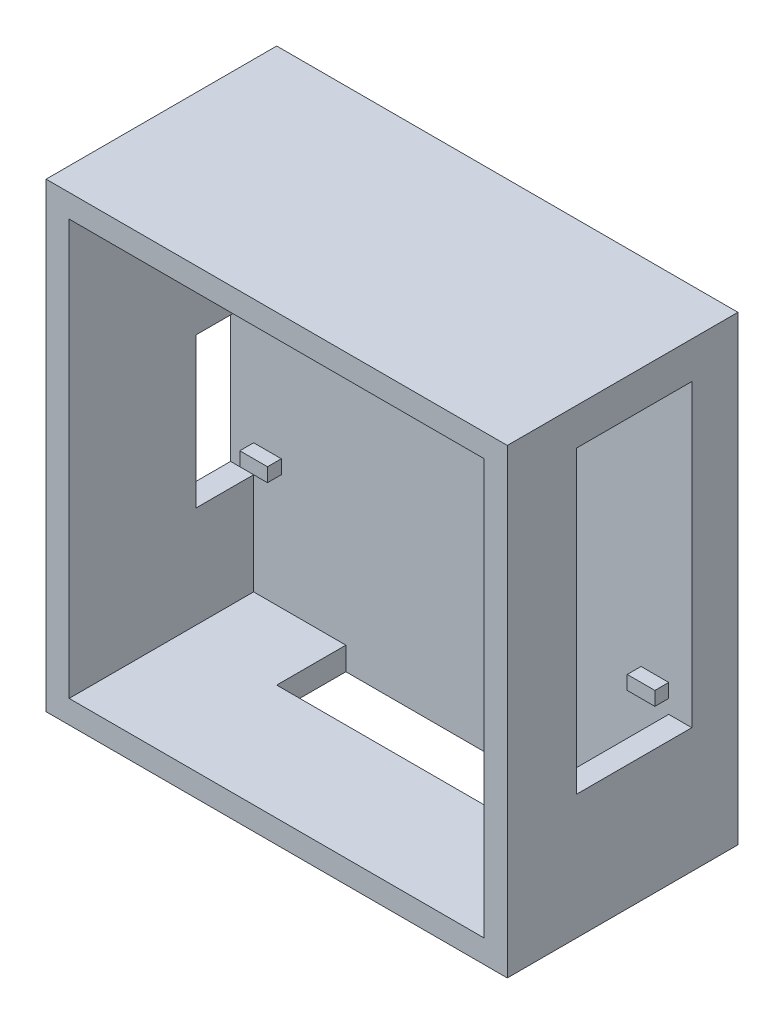
ISO-10303-21;
HEADER;
FILE_DESCRIPTION(('STEP AP214'),'2;1');
FILE_NAME('part.step','',(''),(''),'','','');
FILE_SCHEMA(('AUTOMOTIVE_DESIGN { 1 0 10303 214 1 1 1 1 }'));
ENDSEC;
DATA;
#1=APPLICATION_CONTEXT('core data for automotive mechanical design processes');
#2=APPLICATION_PROTOCOL_DEFINITION('international standard','automotive_design',2000,#1);
#3=PRODUCT_CONTEXT('',#1,'mechanical');
#4=PRODUCT('Part','Part','',(#3));
#5=PRODUCT_RELATED_PRODUCT_CATEGORY('part','',(#4));
#6=PRODUCT_DEFINITION_FORMATION('','',#4);
#7=PRODUCT_DEFINITION_CONTEXT('part definition',#1,'design');
#8=PRODUCT_DEFINITION('design','',#6,#7);
#9=PRODUCT_DEFINITION_SHAPE('','',#8);
#10=(LENGTH_UNIT() NAMED_UNIT(*) SI_UNIT(.MILLI.,.METRE.));
#11=(NAMED_UNIT(*) PLANE_ANGLE_UNIT() SI_UNIT($,.RADIAN.));
#12=(NAMED_UNIT(*) SI_UNIT($,.STERADIAN.) SOLID_ANGLE_UNIT());
#13=UNCERTAINTY_MEASURE_WITH_UNIT(LENGTH_MEASURE(1.E-05),#10,'distance_accuracy_value','');
#14=(GEOMETRIC_REPRESENTATION_CONTEXT(3) GLOBAL_UNCERTAINTY_ASSIGNED_CONTEXT((#13)) GLOBAL_UNIT_ASSIGNED_CONTEXT((#10,
#11,#12)) REPRESENTATION_CONTEXT('',''));
#15=CARTESIAN_POINT('',(0.,0.,0.));
#16=DIRECTION('',(0.,0.,1.));
#17=DIRECTION('',(1.,0.,0.));
#18=AXIS2_PLACEMENT_3D('',#15,#16,#17);
#19=CARTESIAN_POINT('',(0.,0.,10.));
#20=DIRECTION('',(0.,0.,-1.));
#21=DIRECTION('',(-1.,0.,0.));
#22=AXIS2_PLACEMENT_3D('',#19,#20,#21);
#23=PLANE('',#22);
#24=DIRECTION('',(0.,1.,0.));
#25=VECTOR('',#24,1.);
#26=CARTESIAN_POINT('',(11.,30.,10.));
#27=LINE('',#26,#25);
#28=CARTESIAN_POINT('',(11.,30.,10.));
#29=VERTEX_POINT('',#28);
#30=CARTESIAN_POINT('',(11.,33.,10.));
#31=VERTEX_POINT('',#30);
#32=EDGE_CURVE('E248',#29,#31,#27,.T.);
#33=ORIENTED_EDGE('',*,*,#32,.F.);
#34=DIRECTION('',(1.,0.,0.));
#35=VECTOR('',#34,1.);
#36=CARTESIAN_POINT('',(5.,30.,10.));
#37=LINE('',#36,#35);
#38=CARTESIAN_POINT('',(5.,30.,10.));
#39=VERTEX_POINT('',#38);
#40=EDGE_CURVE('E264',#39,#29,#37,.T.);
#41=ORIENTED_EDGE('',*,*,#40,.F.);
#42=DIRECTION('',(0.,-1.,0.));
#43=VECTOR('',#42,1.);
#44=CARTESIAN_POINT('',(5.,30.,10.));
#45=LINE('',#44,#43);
#46=CARTESIAN_POINT('',(5.00000000000001,33.,10.));
#47=VERTEX_POINT('',#46);
#48=EDGE_CURVE('E277',#47,#39,#45,.T.);
#49=ORIENTED_EDGE('',*,*,#48,.F.);
#50=DIRECTION('',(-1.,0.,0.));
#51=VECTOR('',#50,1.);
#52=CARTESIAN_POINT('',(5.00000000000001,33.,10.));
#53=LINE('',#52,#51);
#54=EDGE_CURVE('E253',#31,#47,#53,.T.);
#55=ORIENTED_EDGE('',*,*,#54,.F.);
#56=EDGE_LOOP('',(#33,#41,#49,#55));
#57=FACE_BOUND('',#56,.T.);
#58=DIRECTION('',(1.,0.,0.));
#59=VECTOR('',#58,1.);
#60=CARTESIAN_POINT('',(90.,92.,10.));
#61=LINE('',#60,#59);
#62=CARTESIAN_POINT('',(95.,92.,9.99999999999999));
#63=VERTEX_POINT('',#62);
#64=CARTESIAN_POINT('',(100.,92.,10.));
#65=VERTEX_POINT('',#64);
#66=EDGE_CURVE('E414',#63,#65,#61,.T.);
#67=ORIENTED_EDGE('',*,*,#66,.F.);
#68=DIRECTION('',(0.,1.,0.));
#69=VECTOR('',#68,1.);
#70=CARTESIAN_POINT('',(95.,95.,9.99999999999999));
#71=LINE('',#70,#69);
#72=CARTESIAN_POINT('',(95.,95.,9.99999999999999));
#73=VERTEX_POINT('',#72);
#74=EDGE_CURVE('E324',#63,#73,#71,.T.);
#75=ORIENTED_EDGE('',*,*,#74,.T.);
#76=DIRECTION('',(-1.,0.,0.));
#77=VECTOR('',#76,1.);
#78=CARTESIAN_POINT('',(5.,95.,9.99999999999999));
#79=LINE('',#78,#77);
#80=CARTESIAN_POINT('',(5.,95.,9.99999999999999));
#81=VERTEX_POINT('',#80);
#82=EDGE_CURVE('E303',#73,#81,#79,.T.);
#83=ORIENTED_EDGE('',*,*,#82,.T.);
#84=DIRECTION('',(0.,-1.,0.));
#85=VECTOR('',#84,1.);
#86=CARTESIAN_POINT('',(5.,95.,9.99999999999999));
#87=LINE('',#86,#85);
#88=CARTESIAN_POINT('',(5.00000000000001,59.5,9.99999999999999));
#89=VERTEX_POINT('',#88);
#90=EDGE_CURVE('E331',#81,#89,#87,.T.);
#91=ORIENTED_EDGE('',*,*,#90,.T.);
#92=DIRECTION('',(-1.,0.,0.));
#93=VECTOR('',#92,1.);
#94=CARTESIAN_POINT('',(44.8209706929603,59.5,9.99999999999999));
#95=LINE('',#94,#93);
#96=CARTESIAN_POINT('',(0.,59.5,9.99999999999999));
#97=VERTEX_POINT('',#96);
#98=EDGE_CURVE('E364',#89,#97,#95,.T.);
#99=ORIENTED_EDGE('',*,*,#98,.T.);
#100=DIRECTION('',(0.,1.,0.));
#101=VECTOR('',#100,1.);
#102=CARTESIAN_POINT('',(0.,27.,10.));
#103=LINE('',#102,#101);
#104=CARTESIAN_POINT('',(0.,27.,10.));
#105=VERTEX_POINT('',#104);
#106=EDGE_CURVE('E365',#105,#97,#103,.T.);
#107=ORIENTED_EDGE('',*,*,#106,.F.);
#108=DIRECTION('',(-1.,0.,0.));
#109=VECTOR('',#108,1.);
#110=CARTESIAN_POINT('',(44.8209706929603,27.,10.));
#111=LINE('',#110,#109);
#112=CARTESIAN_POINT('',(5.00000000000001,27.,10.));
#113=VERTEX_POINT('',#112);
#114=EDGE_CURVE('E370',#113,#105,#111,.T.);
#115=ORIENTED_EDGE('',*,*,#114,.F.);
#116=CARTESIAN_POINT('',(5.00000000000001,5.,9.99999999999999));
#117=VERTEX_POINT('',#116);
#118=EDGE_CURVE('E336',#113,#117,#87,.T.);
#119=ORIENTED_EDGE('',*,*,#118,.T.);
#120=DIRECTION('',(1.,0.,0.));
#121=VECTOR('',#120,1.);
#122=CARTESIAN_POINT('',(5.00000000000001,5.,9.99999999999999));
#123=LINE('',#122,#121);
#124=CARTESIAN_POINT('',(25.,5.,9.99999999999999));
#125=VERTEX_POINT('',#124);
#126=EDGE_CURVE('E325',#117,#125,#123,.T.);
#127=ORIENTED_EDGE('',*,*,#126,.T.);
#128=DIRECTION('',(0.,1.,0.));
#129=VECTOR('',#128,1.);
#130=CARTESIAN_POINT('',(25.,-1.2E-05,10.));
#131=LINE('',#130,#129);
#132=CARTESIAN_POINT('',(25.,0.,10.));
#133=VERTEX_POINT('',#132);
#134=EDGE_CURVE('E420',#133,#125,#131,.T.);
#135=ORIENTED_EDGE('',*,*,#134,.F.);
#136=DIRECTION('',(1.,0.,0.));
#137=VECTOR('',#136,1.);
#138=CARTESIAN_POINT('',(0.,0.,10.));
#139=LINE('',#138,#137);
#140=CARTESIAN_POINT('',(75.,0.,10.));
#141=VERTEX_POINT('',#140);
#142=EDGE_CURVE('E446',#133,#141,#139,.T.);
#143=ORIENTED_EDGE('',*,*,#142,.T.);
#144=DIRECTION('',(0.,1.,0.));
#145=VECTOR('',#144,1.);
#146=CARTESIAN_POINT('',(75.,-1.2E-05,10.));
#147=LINE('',#146,#145);
#148=CARTESIAN_POINT('',(75.,5.,9.99999999999999));
#149=VERTEX_POINT('',#148);
#150=EDGE_CURVE('E432',#141,#149,#147,.T.);
#151=ORIENTED_EDGE('',*,*,#150,.T.);
#152=CARTESIAN_POINT('',(95.,5.,9.99999999999999));
#153=VERTEX_POINT('',#152);
#154=EDGE_CURVE('E330',#149,#153,#123,.T.);
#155=ORIENTED_EDGE('',*,*,#154,.T.);
#156=CARTESIAN_POINT('',(95.,27.,9.99999999999999));
#157=VERTEX_POINT('',#156);
#158=EDGE_CURVE('E319',#153,#157,#71,.T.);
#159=ORIENTED_EDGE('',*,*,#158,.T.);
#160=DIRECTION('',(1.,0.,0.));
#161=VECTOR('',#160,1.);
#162=CARTESIAN_POINT('',(90.,27.,10.));
#163=LINE('',#162,#161);
#164=CARTESIAN_POINT('',(100.,27.,10.));
#165=VERTEX_POINT('',#164);
#166=EDGE_CURVE('E411',#157,#165,#163,.T.);
#167=ORIENTED_EDGE('',*,*,#166,.T.);
#168=DIRECTION('',(0.,-1.,0.));
#169=VECTOR('',#168,1.);
#170=CARTESIAN_POINT('',(100.,27.,10.));
#171=LINE('',#170,#169);
#172=EDGE_CURVE('E400',#65,#165,#171,.T.);
#173=ORIENTED_EDGE('',*,*,#172,.F.);
#174=EDGE_LOOP('',(#67,#75,#83,#91,#99,#107,#115,#119,#127,#135,#143,#151,#155,#159,#167,#173));
#175=FACE_BOUND('',#174,.T.);
#176=DIRECTION('',(0.,1.,0.));
#177=VECTOR('',#176,1.);
#178=CARTESIAN_POINT('',(95.,30.,10.));
#179=LINE('',#178,#177);
#180=CARTESIAN_POINT('',(95.,30.,10.));
#181=VERTEX_POINT('',#180);
#182=CARTESIAN_POINT('',(95.,33.,10.));
#183=VERTEX_POINT('',#182);
#184=EDGE_CURVE('E246',#181,#183,#179,.T.);
#185=ORIENTED_EDGE('',*,*,#184,.F.);
#186=DIRECTION('',(1.,0.,0.));
#187=VECTOR('',#186,1.);
#188=CARTESIAN_POINT('',(95.,30.,10.));
#189=LINE('',#188,#187);
#190=CARTESIAN_POINT('',(89.,30.,10.));
#191=VERTEX_POINT('',#190);
#192=EDGE_CURVE('E243',#191,#181,#189,.T.);
#193=ORIENTED_EDGE('',*,*,#192,.F.);
#194=DIRECTION('',(0.,-1.,0.));
#195=VECTOR('',#194,1.);
#196=CARTESIAN_POINT('',(89.,30.,10.));
#197=LINE('',#196,#195);
#198=CARTESIAN_POINT('',(89.,33.,10.));
#199=VERTEX_POINT('',#198);
#200=EDGE_CURVE('E60',#199,#191,#197,.T.);
#201=ORIENTED_EDGE('',*,*,#200,.F.);
#202=DIRECTION('',(-1.,0.,0.));
#203=VECTOR('',#202,1.);
#204=CARTESIAN_POINT('',(95.,33.,10.));
#205=LINE('',#204,#203);
#206=EDGE_CURVE('E55',#183,#199,#205,.T.);
#207=ORIENTED_EDGE('',*,*,#206,.F.);
#208=EDGE_LOOP('',(#185,#193,#201,#207));
#209=FACE_BOUND('',#208,.T.);
#210=ADVANCED_FACE('F39',(#57,#175,#209),#23,.F.);
#211=CARTESIAN_POINT('',(0.,0.,50.));
#212=DIRECTION('',(1.,0.,0.));
#213=DIRECTION('',(0.,0.,-1.));
#214=AXIS2_PLACEMENT_3D('',#211,#212,#213);
#215=PLANE('',#214);
#216=DIRECTION('',(0.,-1.,0.));
#217=VECTOR('',#216,1.);
#218=CARTESIAN_POINT('',(0.,0.,0.));
#219=LINE('',#218,#217);
#220=CARTESIAN_POINT('',(0.,100.,0.));
#221=VERTEX_POINT('',#220);
#222=CARTESIAN_POINT('',(0.,0.,0.));
#223=VERTEX_POINT('',#222);
#224=EDGE_CURVE('E449',#221,#223,#219,.T.);
#225=ORIENTED_EDGE('',*,*,#224,.T.);
#226=DIRECTION('',(0.,0.,-1.));
#227=VECTOR('',#226,1.);
#228=CARTESIAN_POINT('',(0.,0.,50.));
#229=LINE('',#228,#227);
#230=CARTESIAN_POINT('',(0.,0.,50.));
#231=VERTEX_POINT('',#230);
#232=EDGE_CURVE('E487',#231,#223,#229,.T.);
#233=ORIENTED_EDGE('',*,*,#232,.F.);
#234=DIRECTION('',(0.,-1.,0.));
#235=VECTOR('',#234,1.);
#236=CARTESIAN_POINT('',(0.,0.,50.));
#237=LINE('',#236,#235);
#238=CARTESIAN_POINT('',(0.,100.,50.));
#239=VERTEX_POINT('',#238);
#240=EDGE_CURVE('E450',#239,#231,#237,.T.);
#241=ORIENTED_EDGE('',*,*,#240,.F.);
#242=DIRECTION('',(0.,0.,-1.));
#243=VECTOR('',#242,1.);
#244=CARTESIAN_POINT('',(0.,100.,50.));
#245=LINE('',#244,#243);
#246=EDGE_CURVE('E464',#239,#221,#245,.T.);
#247=ORIENTED_EDGE('',*,*,#246,.T.);
#248=EDGE_LOOP('',(#225,#233,#241,#247));
#249=FACE_BOUND('',#248,.T.);
#250=DIRECTION('',(0.,0.,1.));
#251=VECTOR('',#250,1.);
#252=CARTESIAN_POINT('',(0.,59.5,9.99999999999999));
#253=LINE('',#252,#251);
#254=CARTESIAN_POINT('',(0.,59.5,22.5));
#255=VERTEX_POINT('',#254);
#256=EDGE_CURVE('E381',#97,#255,#253,.T.);
#257=ORIENTED_EDGE('',*,*,#256,.T.);
#258=DIRECTION('',(0.,-1.,0.));
#259=VECTOR('',#258,1.);
#260=CARTESIAN_POINT('',(0.,27.,22.5));
#261=LINE('',#260,#259);
#262=CARTESIAN_POINT('',(0.,27.,22.5));
#263=VERTEX_POINT('',#262);
#264=EDGE_CURVE('E376',#255,#263,#261,.T.);
#265=ORIENTED_EDGE('',*,*,#264,.T.);
#266=DIRECTION('',(0.,0.,-1.));
#267=VECTOR('',#266,1.);
#268=CARTESIAN_POINT('',(0.,27.,10.));
#269=LINE('',#268,#267);
#270=EDGE_CURVE('E371',#263,#105,#269,.T.);
#271=ORIENTED_EDGE('',*,*,#270,.T.);
#272=ORIENTED_EDGE('',*,*,#106,.T.);
#273=EDGE_LOOP('',(#257,#265,#271,#272));
#274=FACE_BOUND('',#273,.T.);
#275=ADVANCED_FACE('F41',(#249,#274),#215,.F.);
#276=CARTESIAN_POINT('',(100.,0.,50.));
#277=DIRECTION('',(-1.,0.,0.));
#278=DIRECTION('',(0.,0.,1.));
#279=AXIS2_PLACEMENT_3D('',#276,#277,#278);
#280=PLANE('',#279);
#281=DIRECTION('',(0.,1.,0.));
#282=VECTOR('',#281,1.);
#283=CARTESIAN_POINT('',(100.,0.,0.));
#284=LINE('',#283,#282);
#285=CARTESIAN_POINT('',(100.,0.,0.));
#286=VERTEX_POINT('',#285);
#287=CARTESIAN_POINT('',(100.,100.,0.));
#288=VERTEX_POINT('',#287);
#289=EDGE_CURVE('E471',#286,#288,#284,.T.);
#290=ORIENTED_EDGE('',*,*,#289,.T.);
#291=DIRECTION('',(0.,0.,-1.));
#292=VECTOR('',#291,1.);
#293=CARTESIAN_POINT('',(100.,100.,50.));
#294=LINE('',#293,#292);
#295=CARTESIAN_POINT('',(100.,100.,50.));
#296=VERTEX_POINT('',#295);
#297=EDGE_CURVE('E479',#296,#288,#294,.T.);
#298=ORIENTED_EDGE('',*,*,#297,.F.);
#299=DIRECTION('',(0.,1.,0.));
#300=VECTOR('',#299,1.);
#301=CARTESIAN_POINT('',(100.,0.,50.));
#302=LINE('',#301,#300);
#303=CARTESIAN_POINT('',(100.,0.,50.));
#304=VERTEX_POINT('',#303);
#305=EDGE_CURVE('E458',#304,#296,#302,.T.);
#306=ORIENTED_EDGE('',*,*,#305,.F.);
#307=DIRECTION('',(0.,0.,-1.));
#308=VECTOR('',#307,1.);
#309=CARTESIAN_POINT('',(100.,0.,50.));
#310=LINE('',#309,#308);
#311=EDGE_CURVE('E483',#304,#286,#310,.T.);
#312=ORIENTED_EDGE('',*,*,#311,.T.);
#313=EDGE_LOOP('',(#290,#298,#306,#312));
#314=FACE_BOUND('',#313,.T.);
#315=DIRECTION('',(0.,1.,0.));
#316=VECTOR('',#315,1.);
#317=CARTESIAN_POINT('',(100.,27.,35.));
#318=LINE('',#317,#316);
#319=CARTESIAN_POINT('',(100.,27.,35.));
#320=VERTEX_POINT('',#319);
#321=CARTESIAN_POINT('',(100.,92.,35.));
#322=VERTEX_POINT('',#321);
#323=EDGE_CURVE('E369',#320,#322,#318,.T.);
#324=ORIENTED_EDGE('',*,*,#323,.T.);
#325=DIRECTION('',(0.,0.,-1.));
#326=VECTOR('',#325,1.);
#327=CARTESIAN_POINT('',(100.,92.,35.));
#328=LINE('',#327,#326);
#329=EDGE_CURVE('E396',#322,#65,#328,.T.);
#330=ORIENTED_EDGE('',*,*,#329,.T.);
#331=ORIENTED_EDGE('',*,*,#172,.T.);
#332=DIRECTION('',(0.,0.,1.));
#333=VECTOR('',#332,1.);
#334=CARTESIAN_POINT('',(100.,27.,35.));
#335=LINE('',#334,#333);
#336=EDGE_CURVE('E404',#165,#320,#335,.T.);
#337=ORIENTED_EDGE('',*,*,#336,.T.);
#338=EDGE_LOOP('',(#324,#330,#331,#337));
#339=FACE_BOUND('',#338,.T.);
#340=ADVANCED_FACE('F510',(#314,#339),#280,.F.);
#341=CARTESIAN_POINT('',(0.,0.,50.));
#342=DIRECTION('',(0.,1.,0.));
#343=DIRECTION('',(0.,0.,1.));
#344=AXIS2_PLACEMENT_3D('',#341,#342,#343);
#345=PLANE('',#344);
#346=DIRECTION('',(1.,0.,0.));
#347=VECTOR('',#346,1.);
#348=CARTESIAN_POINT('',(0.,0.,0.));
#349=LINE('',#348,#347);
#350=EDGE_CURVE('E468',#223,#286,#349,.T.);
#351=ORIENTED_EDGE('',*,*,#350,.T.);
#352=ORIENTED_EDGE('',*,*,#311,.F.);
#353=DIRECTION('',(1.,0.,0.));
#354=VECTOR('',#353,1.);
#355=CARTESIAN_POINT('',(0.,0.,50.));
#356=LINE('',#355,#354);
#357=EDGE_CURVE('E454',#231,#304,#356,.T.);
#358=ORIENTED_EDGE('',*,*,#357,.F.);
#359=ORIENTED_EDGE('',*,*,#232,.T.);
#360=EDGE_LOOP('',(#351,#352,#358,#359));
#361=FACE_BOUND('',#360,.T.);
#362=ORIENTED_EDGE('',*,*,#142,.F.);
#363=DIRECTION('',(0.,0.,-1.));
#364=VECTOR('',#363,1.);
#365=CARTESIAN_POINT('',(25.,0.,50.));
#366=LINE('',#365,#364);
#367=CARTESIAN_POINT('',(25.,0.,25.));
#368=VERTEX_POINT('',#367);
#369=EDGE_CURVE('E436',#368,#133,#366,.T.);
#370=ORIENTED_EDGE('',*,*,#369,.F.);
#371=DIRECTION('',(-1.,0.,0.));
#372=VECTOR('',#371,1.);
#373=CARTESIAN_POINT('',(0.,0.,25.));
#374=LINE('',#373,#372);
#375=CARTESIAN_POINT('',(75.,0.,25.));
#376=VERTEX_POINT('',#375);
#377=EDGE_CURVE('E439',#376,#368,#374,.T.);
#378=ORIENTED_EDGE('',*,*,#377,.F.);
#379=DIRECTION('',(0.,0.,1.));
#380=VECTOR('',#379,1.);
#381=CARTESIAN_POINT('',(75.,0.,50.));
#382=LINE('',#381,#380);
#383=EDGE_CURVE('E443',#141,#376,#382,.T.);
#384=ORIENTED_EDGE('',*,*,#383,.F.);
#385=EDGE_LOOP('',(#362,#370,#378,#384));
#386=FACE_BOUND('',#385,.T.);
#387=ADVANCED_FACE('F546',(#361,#386),#345,.F.);
#388=CARTESIAN_POINT('',(0.,0.,50.));
#389=DIRECTION('',(0.,0.,-1.));
#390=DIRECTION('',(-1.,0.,0.));
#391=AXIS2_PLACEMENT_3D('',#388,#389,#390);
#392=PLANE('',#391);
#393=DIRECTION('',(0.,-1.,0.));
#394=VECTOR('',#393,1.);
#395=CARTESIAN_POINT('',(5.,95.,50.));
#396=LINE('',#395,#394);
#397=CARTESIAN_POINT('',(5.,95.,50.));
#398=VERTEX_POINT('',#397);
#399=CARTESIAN_POINT('',(5.00000000000001,5.,50.));
#400=VERTEX_POINT('',#399);
#401=EDGE_CURVE('E304',#398,#400,#396,.T.);
#402=ORIENTED_EDGE('',*,*,#401,.F.);
#403=DIRECTION('',(-1.,0.,0.));
#404=VECTOR('',#403,1.);
#405=CARTESIAN_POINT('',(5.,95.,50.));
#406=LINE('',#405,#404);
#407=CARTESIAN_POINT('',(95.,95.,50.));
#408=VERTEX_POINT('',#407);
#409=EDGE_CURVE('E308',#408,#398,#406,.T.);
#410=ORIENTED_EDGE('',*,*,#409,.F.);
#411=DIRECTION('',(0.,1.,0.));
#412=VECTOR('',#411,1.);
#413=CARTESIAN_POINT('',(95.,95.,50.));
#414=LINE('',#413,#412);
#415=CARTESIAN_POINT('',(95.,5.,50.));
#416=VERTEX_POINT('',#415);
#417=EDGE_CURVE('E299',#416,#408,#414,.T.);
#418=ORIENTED_EDGE('',*,*,#417,.F.);
#419=DIRECTION('',(1.,0.,0.));
#420=VECTOR('',#419,1.);
#421=CARTESIAN_POINT('',(5.00000000000001,5.,50.));
#422=LINE('',#421,#420);
#423=EDGE_CURVE('E300',#400,#416,#422,.T.);
#424=ORIENTED_EDGE('',*,*,#423,.F.);
#425=EDGE_LOOP('',(#402,#410,#418,#424));
#426=FACE_BOUND('',#425,.T.);
#427=ORIENTED_EDGE('',*,*,#240,.T.);
#428=ORIENTED_EDGE('',*,*,#357,.T.);
#429=ORIENTED_EDGE('',*,*,#305,.T.);
#430=DIRECTION('',(-1.,0.,0.));
#431=VECTOR('',#430,1.);
#432=CARTESIAN_POINT('',(0.,100.,50.));
#433=LINE('',#432,#431);
#434=EDGE_CURVE('E461',#296,#239,#433,.T.);
#435=ORIENTED_EDGE('',*,*,#434,.T.);
#436=EDGE_LOOP('',(#427,#428,#429,#435));
#437=FACE_BOUND('',#436,.T.);
#438=ADVANCED_FACE('F542',(#426,#437),#392,.F.);
#439=CARTESIAN_POINT('',(0.,100.,50.));
#440=DIRECTION('',(0.,-1.,0.));
#441=DIRECTION('',(0.,0.,-1.));
#442=AXIS2_PLACEMENT_3D('',#439,#440,#441);
#443=PLANE('',#442);
#444=DIRECTION('',(-1.,0.,0.));
#445=VECTOR('',#444,1.);
#446=CARTESIAN_POINT('',(0.,100.,0.));
#447=LINE('',#446,#445);
#448=EDGE_CURVE('E455',#288,#221,#447,.T.);
#449=ORIENTED_EDGE('',*,*,#448,.T.);
#450=ORIENTED_EDGE('',*,*,#246,.F.);
#451=ORIENTED_EDGE('',*,*,#434,.F.);
#452=ORIENTED_EDGE('',*,*,#297,.T.);
#453=EDGE_LOOP('',(#449,#450,#451,#452));
#454=FACE_BOUND('',#453,.T.);
#455=ADVANCED_FACE('F545',(#454),#443,.F.);
#456=CARTESIAN_POINT('',(0.,0.,0.));
#457=DIRECTION('',(0.,0.,-1.));
#458=DIRECTION('',(-1.,0.,0.));
#459=AXIS2_PLACEMENT_3D('',#456,#457,#458);
#460=PLANE('',#459);
#461=ORIENTED_EDGE('',*,*,#224,.F.);
#462=ORIENTED_EDGE('',*,*,#448,.F.);
#463=ORIENTED_EDGE('',*,*,#289,.F.);
#464=ORIENTED_EDGE('',*,*,#350,.F.);
#465=EDGE_LOOP('',(#461,#462,#463,#464));
#466=FACE_BOUND('',#465,.T.);
#467=ADVANCED_FACE('F548',(#466),#460,.T.);
#468=CARTESIAN_POINT('',(75.,-1.2E-05,25.));
#469=DIRECTION('',(-1.,0.,0.));
#470=DIRECTION('',(0.,0.,1.));
#471=AXIS2_PLACEMENT_3D('',#468,#469,#470);
#472=PLANE('',#471);
#473=DIRECTION('',(0.,0.,1.));
#474=VECTOR('',#473,1.);
#475=CARTESIAN_POINT('',(75.,5.,25.));
#476=LINE('',#475,#474);
#477=CARTESIAN_POINT('',(75.,5.,25.));
#478=VERTEX_POINT('',#477);
#479=EDGE_CURVE('E361',#149,#478,#476,.T.);
#480=ORIENTED_EDGE('',*,*,#479,.F.);
#481=ORIENTED_EDGE('',*,*,#150,.F.);
#482=ORIENTED_EDGE('',*,*,#383,.T.);
#483=DIRECTION('',(0.,1.,0.));
#484=VECTOR('',#483,1.);
#485=CARTESIAN_POINT('',(75.,-1.2E-05,25.));
#486=LINE('',#485,#484);
#487=EDGE_CURVE('E428',#376,#478,#486,.T.);
#488=ORIENTED_EDGE('',*,*,#487,.T.);
#489=EDGE_LOOP('',(#480,#481,#482,#488));
#490=FACE_BOUND('',#489,.T.);
#491=ADVANCED_FACE('F540',(#490),#472,.T.);
#492=CARTESIAN_POINT('',(25.,-1.2E-05,25.));
#493=DIRECTION('',(0.,0.,-1.));
#494=DIRECTION('',(-1.,0.,0.));
#495=AXIS2_PLACEMENT_3D('',#492,#493,#494);
#496=PLANE('',#495);
#497=DIRECTION('',(-1.,0.,0.));
#498=VECTOR('',#497,1.);
#499=CARTESIAN_POINT('',(25.,5.,25.));
#500=LINE('',#499,#498);
#501=CARTESIAN_POINT('',(25.,5.,25.));
#502=VERTEX_POINT('',#501);
#503=EDGE_CURVE('E358',#478,#502,#500,.T.);
#504=ORIENTED_EDGE('',*,*,#503,.F.);
#505=ORIENTED_EDGE('',*,*,#487,.F.);
#506=ORIENTED_EDGE('',*,*,#377,.T.);
#507=DIRECTION('',(0.,1.,0.));
#508=VECTOR('',#507,1.);
#509=CARTESIAN_POINT('',(25.,-1.2E-05,25.));
#510=LINE('',#509,#508);
#511=EDGE_CURVE('E424',#368,#502,#510,.T.);
#512=ORIENTED_EDGE('',*,*,#511,.T.);
#513=EDGE_LOOP('',(#504,#505,#506,#512));
#514=FACE_BOUND('',#513,.T.);
#515=ADVANCED_FACE('F528',(#514),#496,.T.);
#516=CARTESIAN_POINT('',(25.,-1.2E-05,10.));
#517=DIRECTION('',(1.,0.,0.));
#518=DIRECTION('',(0.,0.,-1.));
#519=AXIS2_PLACEMENT_3D('',#516,#517,#518);
#520=PLANE('',#519);
#521=DIRECTION('',(0.,0.,-1.));
#522=VECTOR('',#521,1.);
#523=CARTESIAN_POINT('',(25.,5.,10.));
#524=LINE('',#523,#522);
#525=EDGE_CURVE('E11',#502,#125,#524,.T.);
#526=ORIENTED_EDGE('',*,*,#525,.F.);
#527=ORIENTED_EDGE('',*,*,#511,.F.);
#528=ORIENTED_EDGE('',*,*,#369,.T.);
#529=ORIENTED_EDGE('',*,*,#134,.T.);
#530=EDGE_LOOP('',(#526,#527,#528,#529));
#531=FACE_BOUND('',#530,.T.);
#532=ADVANCED_FACE('F521',(#531),#520,.T.);
#533=CARTESIAN_POINT('',(90.,27.,35.));
#534=DIRECTION('',(0.,0.,-1.));
#535=DIRECTION('',(-1.,0.,0.));
#536=AXIS2_PLACEMENT_3D('',#533,#534,#535);
#537=PLANE('',#536);
#538=DIRECTION('',(0.,-1.,0.));
#539=VECTOR('',#538,1.);
#540=CARTESIAN_POINT('',(95.,27.,35.));
#541=LINE('',#540,#539);
#542=CARTESIAN_POINT('',(95.,92.,35.));
#543=VERTEX_POINT('',#542);
#544=CARTESIAN_POINT('',(95.,27.,35.));
#545=VERTEX_POINT('',#544);
#546=EDGE_CURVE('E352',#543,#545,#541,.T.);
#547=ORIENTED_EDGE('',*,*,#546,.F.);
#548=DIRECTION('',(1.,0.,0.));
#549=VECTOR('',#548,1.);
#550=CARTESIAN_POINT('',(90.,92.,35.));
#551=LINE('',#550,#549);
#552=EDGE_CURVE('E417',#543,#322,#551,.T.);
#553=ORIENTED_EDGE('',*,*,#552,.T.);
#554=ORIENTED_EDGE('',*,*,#323,.F.);
#555=DIRECTION('',(1.,0.,0.));
#556=VECTOR('',#555,1.);
#557=CARTESIAN_POINT('',(90.,27.,35.));
#558=LINE('',#557,#556);
#559=EDGE_CURVE('E408',#545,#320,#558,.T.);
#560=ORIENTED_EDGE('',*,*,#559,.F.);
#561=EDGE_LOOP('',(#547,#553,#554,#560));
#562=FACE_BOUND('',#561,.T.);
#563=ADVANCED_FACE('F519',(#562),#537,.T.);
#564=CARTESIAN_POINT('',(90.,92.,35.));
#565=DIRECTION('',(0.,-1.,0.));
#566=DIRECTION('',(0.,0.,-1.));
#567=AXIS2_PLACEMENT_3D('',#564,#565,#566);
#568=PLANE('',#567);
#569=DIRECTION('',(0.,0.,1.));
#570=VECTOR('',#569,1.);
#571=CARTESIAN_POINT('',(95.,92.,35.));
#572=LINE('',#571,#570);
#573=EDGE_CURVE('E355',#63,#543,#572,.T.);
#574=ORIENTED_EDGE('',*,*,#573,.F.);
#575=ORIENTED_EDGE('',*,*,#66,.T.);
#576=ORIENTED_EDGE('',*,*,#329,.F.);
#577=ORIENTED_EDGE('',*,*,#552,.F.);
#578=EDGE_LOOP('',(#574,#575,#576,#577));
#579=FACE_BOUND('',#578,.T.);
#580=ADVANCED_FACE('F515',(#579),#568,.T.);
#581=CARTESIAN_POINT('',(90.,27.,35.));
#582=DIRECTION('',(0.,1.,0.));
#583=DIRECTION('',(0.,0.,1.));
#584=AXIS2_PLACEMENT_3D('',#581,#582,#583);
#585=PLANE('',#584);
#586=DIRECTION('',(0.,0.,-1.));
#587=VECTOR('',#586,1.);
#588=CARTESIAN_POINT('',(95.,27.,35.));
#589=LINE('',#588,#587);
#590=EDGE_CURVE('E48',#545,#157,#589,.T.);
#591=ORIENTED_EDGE('',*,*,#590,.F.);
#592=ORIENTED_EDGE('',*,*,#559,.T.);
#593=ORIENTED_EDGE('',*,*,#336,.F.);
#594=ORIENTED_EDGE('',*,*,#166,.F.);
#595=EDGE_LOOP('',(#591,#592,#593,#594));
#596=FACE_BOUND('',#595,.T.);
#597=ADVANCED_FACE('F507',(#596),#585,.T.);
#598=CARTESIAN_POINT('',(44.8209706929603,59.5,9.99999999999999));
#599=DIRECTION('',(0.,-1.,0.));
#600=DIRECTION('',(0.,0.,-1.));
#601=AXIS2_PLACEMENT_3D('',#598,#599,#600);
#602=PLANE('',#601);
#603=DIRECTION('',(0.,0.,-1.));
#604=VECTOR('',#603,1.);
#605=CARTESIAN_POINT('',(5.,59.5,9.99999999999999));
#606=LINE('',#605,#604);
#607=CARTESIAN_POINT('',(5.00000000000001,59.5,22.5));
#608=VERTEX_POINT('',#607);
#609=EDGE_CURVE('E349',#608,#89,#606,.T.);
#610=ORIENTED_EDGE('',*,*,#609,.F.);
#611=DIRECTION('',(-1.,0.,0.));
#612=VECTOR('',#611,1.);
#613=CARTESIAN_POINT('',(44.8209706929603,59.5,22.5));
#614=LINE('',#613,#612);
#615=EDGE_CURVE('E380',#608,#255,#614,.T.);
#616=ORIENTED_EDGE('',*,*,#615,.T.);
#617=ORIENTED_EDGE('',*,*,#256,.F.);
#618=ORIENTED_EDGE('',*,*,#98,.F.);
#619=EDGE_LOOP('',(#610,#616,#617,#618));
#620=FACE_BOUND('',#619,.T.);
#621=ADVANCED_FACE('F599',(#620),#602,.T.);
#622=CARTESIAN_POINT('',(44.8209706929603,27.,22.5));
#623=DIRECTION('',(0.,0.,-1.));
#624=DIRECTION('',(-1.,0.,0.));
#625=AXIS2_PLACEMENT_3D('',#622,#623,#624);
#626=PLANE('',#625);
#627=DIRECTION('',(0.,1.,0.));
#628=VECTOR('',#627,1.);
#629=CARTESIAN_POINT('',(5.00000000000001,27.,22.5));
#630=LINE('',#629,#628);
#631=CARTESIAN_POINT('',(5.00000000000001,27.,22.5));
#632=VERTEX_POINT('',#631);
#633=EDGE_CURVE('E346',#632,#608,#630,.T.);
#634=ORIENTED_EDGE('',*,*,#633,.F.);
#635=DIRECTION('',(-1.,0.,0.));
#636=VECTOR('',#635,1.);
#637=CARTESIAN_POINT('',(44.8209706929603,27.,22.5));
#638=LINE('',#637,#636);
#639=EDGE_CURVE('E375',#632,#263,#638,.T.);
#640=ORIENTED_EDGE('',*,*,#639,.T.);
#641=ORIENTED_EDGE('',*,*,#264,.F.);
#642=ORIENTED_EDGE('',*,*,#615,.F.);
#643=EDGE_LOOP('',(#634,#640,#641,#642));
#644=FACE_BOUND('',#643,.T.);
#645=ADVANCED_FACE('F594',(#644),#626,.T.);
#646=CARTESIAN_POINT('',(44.8209706929603,27.,10.));
#647=DIRECTION('',(0.,1.,0.));
#648=DIRECTION('',(0.,0.,1.));
#649=AXIS2_PLACEMENT_3D('',#646,#647,#648);
#650=PLANE('',#649);
#651=DIRECTION('',(0.,0.,1.));
#652=VECTOR('',#651,1.);
#653=CARTESIAN_POINT('',(5.00000000000001,27.,10.));
#654=LINE('',#653,#652);
#655=EDGE_CURVE('E491',#113,#632,#654,.T.);
#656=ORIENTED_EDGE('',*,*,#655,.F.);
#657=ORIENTED_EDGE('',*,*,#114,.T.);
#658=ORIENTED_EDGE('',*,*,#270,.F.);
#659=ORIENTED_EDGE('',*,*,#639,.F.);
#660=EDGE_LOOP('',(#656,#657,#658,#659));
#661=FACE_BOUND('',#660,.T.);
#662=ADVANCED_FACE('F590',(#661),#650,.T.);
#663=CARTESIAN_POINT('',(5.,95.,-117.279220613579));
#664=DIRECTION('',(0.,1.,0.));
#665=DIRECTION('',(0.,0.,1.));
#666=AXIS2_PLACEMENT_3D('',#663,#664,#665);
#667=PLANE('',#666);
#668=DIRECTION('',(0.,0.,1.));
#669=VECTOR('',#668,1.);
#670=CARTESIAN_POINT('',(95.,95.,-117.279220613579));
#671=LINE('',#670,#669);
#672=EDGE_CURVE('E323',#73,#408,#671,.T.);
#673=ORIENTED_EDGE('',*,*,#672,.T.);
#674=ORIENTED_EDGE('',*,*,#409,.T.);
#675=DIRECTION('',(0.,0.,1.));
#676=VECTOR('',#675,1.);
#677=CARTESIAN_POINT('',(5.,95.,-117.279220613579));
#678=LINE('',#677,#676);
#679=EDGE_CURVE('E318',#81,#398,#678,.T.);
#680=ORIENTED_EDGE('',*,*,#679,.F.);
#681=ORIENTED_EDGE('',*,*,#82,.F.);
#682=EDGE_LOOP('',(#673,#674,#680,#681));
#683=FACE_BOUND('',#682,.T.);
#684=ADVANCED_FACE('F603',(#683),#667,.F.);
#685=CARTESIAN_POINT('',(5.,95.,-117.279220613579));
#686=DIRECTION('',(-1.,0.,0.));
#687=DIRECTION('',(0.,-1.,0.));
#688=AXIS2_PLACEMENT_3D('',#685,#686,#687);
#689=PLANE('',#688);
#690=ORIENTED_EDGE('',*,*,#609,.T.);
#691=ORIENTED_EDGE('',*,*,#90,.F.);
#692=ORIENTED_EDGE('',*,*,#679,.T.);
#693=ORIENTED_EDGE('',*,*,#401,.T.);
#694=DIRECTION('',(0.,0.,1.));
#695=VECTOR('',#694,1.);
#696=CARTESIAN_POINT('',(5.00000000000001,5.,-117.279220613579));
#697=LINE('',#696,#695);
#698=EDGE_CURVE('E335',#117,#400,#697,.T.);
#699=ORIENTED_EDGE('',*,*,#698,.F.);
#700=ORIENTED_EDGE('',*,*,#118,.F.);
#701=ORIENTED_EDGE('',*,*,#655,.T.);
#702=ORIENTED_EDGE('',*,*,#633,.T.);
#703=EDGE_LOOP('',(#690,#691,#692,#693,#699,#700,#701,#702));
#704=FACE_BOUND('',#703,.T.);
#705=ADVANCED_FACE('F586',(#704),#689,.F.);
#706=CARTESIAN_POINT('',(5.00000000000001,5.,-117.279220613579));
#707=DIRECTION('',(0.,-1.,0.));
#708=DIRECTION('',(1.,0.,0.));
#709=AXIS2_PLACEMENT_3D('',#706,#707,#708);
#710=PLANE('',#709);
#711=ORIENTED_EDGE('',*,*,#479,.T.);
#712=ORIENTED_EDGE('',*,*,#503,.T.);
#713=ORIENTED_EDGE('',*,*,#525,.T.);
#714=ORIENTED_EDGE('',*,*,#126,.F.);
#715=ORIENTED_EDGE('',*,*,#698,.T.);
#716=ORIENTED_EDGE('',*,*,#423,.T.);
#717=DIRECTION('',(0.,0.,1.));
#718=VECTOR('',#717,1.);
#719=CARTESIAN_POINT('',(95.,5.,-117.279220613579));
#720=LINE('',#719,#718);
#721=EDGE_CURVE('E329',#153,#416,#720,.T.);
#722=ORIENTED_EDGE('',*,*,#721,.F.);
#723=ORIENTED_EDGE('',*,*,#154,.F.);
#724=EDGE_LOOP('',(#711,#712,#713,#714,#715,#716,#722,#723));
#725=FACE_BOUND('',#724,.T.);
#726=ADVANCED_FACE('F574',(#725),#710,.F.);
#727=CARTESIAN_POINT('',(95.,95.,-117.279220613579));
#728=DIRECTION('',(1.,0.,0.));
#729=DIRECTION('',(0.,1.,0.));
#730=AXIS2_PLACEMENT_3D('',#727,#728,#729);
#731=PLANE('',#730);
#732=ORIENTED_EDGE('',*,*,#573,.T.);
#733=ORIENTED_EDGE('',*,*,#546,.T.);
#734=ORIENTED_EDGE('',*,*,#590,.T.);
#735=ORIENTED_EDGE('',*,*,#158,.F.);
#736=ORIENTED_EDGE('',*,*,#721,.T.);
#737=ORIENTED_EDGE('',*,*,#417,.T.);
#738=ORIENTED_EDGE('',*,*,#672,.F.);
#739=ORIENTED_EDGE('',*,*,#74,.F.);
#740=EDGE_LOOP('',(#732,#733,#734,#735,#736,#737,#738,#739));
#741=FACE_BOUND('',#740,.T.);
#742=ADVANCED_FACE('F497',(#741),#731,.F.);
#743=CARTESIAN_POINT('',(11.,30.,13.));
#744=DIRECTION('',(-1.,0.,0.));
#745=DIRECTION('',(0.,0.,1.));
#746=AXIS2_PLACEMENT_3D('',#743,#744,#745);
#747=PLANE('',#746);
#748=ORIENTED_EDGE('',*,*,#32,.T.);
#749=DIRECTION('',(0.,0.,-1.));
#750=VECTOR('',#749,1.);
#751=CARTESIAN_POINT('',(11.,33.,13.));
#752=LINE('',#751,#750);
#753=CARTESIAN_POINT('',(11.,33.,13.));
#754=VERTEX_POINT('',#753);
#755=EDGE_CURVE('E295',#754,#31,#752,.T.);
#756=ORIENTED_EDGE('',*,*,#755,.F.);
#757=DIRECTION('',(0.,1.,0.));
#758=VECTOR('',#757,1.);
#759=CARTESIAN_POINT('',(11.,30.,13.));
#760=LINE('',#759,#758);
#761=CARTESIAN_POINT('',(11.,30.,13.));
#762=VERTEX_POINT('',#761);
#763=EDGE_CURVE('E259',#762,#754,#760,.T.);
#764=ORIENTED_EDGE('',*,*,#763,.F.);
#765=DIRECTION('',(0.,0.,-1.));
#766=VECTOR('',#765,1.);
#767=CARTESIAN_POINT('',(11.,30.,13.));
#768=LINE('',#767,#766);
#769=EDGE_CURVE('E272',#762,#29,#768,.T.);
#770=ORIENTED_EDGE('',*,*,#769,.T.);
#771=EDGE_LOOP('',(#748,#756,#764,#770));
#772=FACE_BOUND('',#771,.T.);
#773=ADVANCED_FACE('F675',(#772),#747,.F.);
#774=CARTESIAN_POINT('',(5.00000000000001,33.,13.));
#775=DIRECTION('',(0.,-1.,0.));
#776=DIRECTION('',(0.,0.,-1.));
#777=AXIS2_PLACEMENT_3D('',#774,#775,#776);
#778=PLANE('',#777);
#779=ORIENTED_EDGE('',*,*,#54,.T.);
#780=DIRECTION('',(0.,0.,-1.));
#781=VECTOR('',#780,1.);
#782=CARTESIAN_POINT('',(5.00000000000001,33.,13.));
#783=LINE('',#782,#781);
#784=CARTESIAN_POINT('',(5.00000000000001,33.,13.));
#785=VERTEX_POINT('',#784);
#786=EDGE_CURVE('E291',#785,#47,#783,.T.);
#787=ORIENTED_EDGE('',*,*,#786,.F.);
#788=DIRECTION('',(-1.,0.,0.));
#789=VECTOR('',#788,1.);
#790=CARTESIAN_POINT('',(5.00000000000001,33.,13.));
#791=LINE('',#790,#789);
#792=EDGE_CURVE('E263',#754,#785,#791,.T.);
#793=ORIENTED_EDGE('',*,*,#792,.F.);
#794=ORIENTED_EDGE('',*,*,#755,.T.);
#795=EDGE_LOOP('',(#779,#787,#793,#794));
#796=FACE_BOUND('',#795,.T.);
#797=ADVANCED_FACE('F691',(#796),#778,.F.);
#798=CARTESIAN_POINT('',(5.,30.,13.));
#799=DIRECTION('',(1.,0.,0.));
#800=DIRECTION('',(0.,1.,0.));
#801=AXIS2_PLACEMENT_3D('',#798,#799,#800);
#802=PLANE('',#801);
#803=ORIENTED_EDGE('',*,*,#48,.T.);
#804=DIRECTION('',(0.,0.,-1.));
#805=VECTOR('',#804,1.);
#806=CARTESIAN_POINT('',(5.,30.,13.));
#807=LINE('',#806,#805);
#808=CARTESIAN_POINT('',(5.,30.,13.));
#809=VERTEX_POINT('',#808);
#810=EDGE_CURVE('E287',#809,#39,#807,.T.);
#811=ORIENTED_EDGE('',*,*,#810,.F.);
#812=DIRECTION('',(0.,-1.,0.));
#813=VECTOR('',#812,1.);
#814=CARTESIAN_POINT('',(5.,30.,13.));
#815=LINE('',#814,#813);
#816=EDGE_CURVE('E267',#785,#809,#815,.T.);
#817=ORIENTED_EDGE('',*,*,#816,.F.);
#818=ORIENTED_EDGE('',*,*,#786,.T.);
#819=EDGE_LOOP('',(#803,#811,#817,#818));
#820=FACE_BOUND('',#819,.T.);
#821=ADVANCED_FACE('F701',(#820),#802,.F.);
#822=CARTESIAN_POINT('',(5.,30.,13.));
#823=DIRECTION('',(0.,1.,0.));
#824=DIRECTION('',(0.,0.,1.));
#825=AXIS2_PLACEMENT_3D('',#822,#823,#824);
#826=PLANE('',#825);
#827=ORIENTED_EDGE('',*,*,#40,.T.);
#828=ORIENTED_EDGE('',*,*,#769,.F.);
#829=DIRECTION('',(1.,0.,0.));
#830=VECTOR('',#829,1.);
#831=CARTESIAN_POINT('',(5.,30.,13.));
#832=LINE('',#831,#830);
#833=EDGE_CURVE('E270',#809,#762,#832,.T.);
#834=ORIENTED_EDGE('',*,*,#833,.F.);
#835=ORIENTED_EDGE('',*,*,#810,.T.);
#836=EDGE_LOOP('',(#827,#828,#834,#835));
#837=FACE_BOUND('',#836,.T.);
#838=ADVANCED_FACE('F711',(#837),#826,.F.);
#839=CARTESIAN_POINT('',(0.,0.,13.));
#840=DIRECTION('',(0.,0.,-1.));
#841=DIRECTION('',(-1.,0.,0.));
#842=AXIS2_PLACEMENT_3D('',#839,#840,#841);
#843=PLANE('',#842);
#844=ORIENTED_EDGE('',*,*,#763,.T.);
#845=ORIENTED_EDGE('',*,*,#792,.T.);
#846=ORIENTED_EDGE('',*,*,#816,.T.);
#847=ORIENTED_EDGE('',*,*,#833,.T.);
#848=EDGE_LOOP('',(#844,#845,#846,#847));
#849=FACE_BOUND('',#848,.T.);
#850=ADVANCED_FACE('F721',(#849),#843,.F.);
#851=CARTESIAN_POINT('',(95.,30.,13.));
#852=DIRECTION('',(-1.,0.,0.));
#853=DIRECTION('',(0.,0.,1.));
#854=AXIS2_PLACEMENT_3D('',#851,#852,#853);
#855=PLANE('',#854);
#856=ORIENTED_EDGE('',*,*,#184,.T.);
#857=DIRECTION('',(0.,0.,-1.));
#858=VECTOR('',#857,1.);
#859=CARTESIAN_POINT('',(95.,33.,13.));
#860=LINE('',#859,#858);
#861=CARTESIAN_POINT('',(95.,33.,13.));
#862=VERTEX_POINT('',#861);
#863=EDGE_CURVE('E225',#862,#183,#860,.T.);
#864=ORIENTED_EDGE('',*,*,#863,.F.);
#865=DIRECTION('',(0.,1.,0.));
#866=VECTOR('',#865,1.);
#867=CARTESIAN_POINT('',(95.,30.,13.));
#868=LINE('',#867,#866);
#869=CARTESIAN_POINT('',(95.,30.,13.));
#870=VERTEX_POINT('',#869);
#871=EDGE_CURVE('E233',#870,#862,#868,.T.);
#872=ORIENTED_EDGE('',*,*,#871,.F.);
#873=DIRECTION('',(0.,0.,-1.));
#874=VECTOR('',#873,1.);
#875=CARTESIAN_POINT('',(95.,30.,13.));
#876=LINE('',#875,#874);
#877=EDGE_CURVE('E781',#870,#181,#876,.T.);
#878=ORIENTED_EDGE('',*,*,#877,.T.);
#879=EDGE_LOOP('',(#856,#864,#872,#878));
#880=FACE_BOUND('',#879,.T.);
#881=ADVANCED_FACE('F245',(#880),#855,.F.);
#882=CARTESIAN_POINT('',(95.,33.,13.));
#883=DIRECTION('',(0.,-1.,0.));
#884=DIRECTION('',(0.,0.,-1.));
#885=AXIS2_PLACEMENT_3D('',#882,#883,#884);
#886=PLANE('',#885);
#887=ORIENTED_EDGE('',*,*,#206,.T.);
#888=DIRECTION('',(0.,0.,-1.));
#889=VECTOR('',#888,1.);
#890=CARTESIAN_POINT('',(89.,33.,13.));
#891=LINE('',#890,#889);
#892=CARTESIAN_POINT('',(89.,33.,13.));
#893=VERTEX_POINT('',#892);
#894=EDGE_CURVE('E228',#893,#199,#891,.T.);
#895=ORIENTED_EDGE('',*,*,#894,.F.);
#896=DIRECTION('',(-1.,0.,0.));
#897=VECTOR('',#896,1.);
#898=CARTESIAN_POINT('',(95.,33.,13.));
#899=LINE('',#898,#897);
#900=EDGE_CURVE('E221',#862,#893,#899,.T.);
#901=ORIENTED_EDGE('',*,*,#900,.F.);
#902=ORIENTED_EDGE('',*,*,#863,.T.);
#903=EDGE_LOOP('',(#887,#895,#901,#902));
#904=FACE_BOUND('',#903,.T.);
#905=ADVANCED_FACE('F223',(#904),#886,.F.);
#906=CARTESIAN_POINT('',(89.,30.,13.));
#907=DIRECTION('',(1.,0.,0.));
#908=DIRECTION('',(0.,0.,-1.));
#909=AXIS2_PLACEMENT_3D('',#906,#907,#908);
#910=PLANE('',#909);
#911=ORIENTED_EDGE('',*,*,#200,.T.);
#912=DIRECTION('',(0.,0.,-1.));
#913=VECTOR('',#912,1.);
#914=CARTESIAN_POINT('',(89.,30.,13.));
#915=LINE('',#914,#913);
#916=CARTESIAN_POINT('',(89.,30.,13.));
#917=VERTEX_POINT('',#916);
#918=EDGE_CURVE('E255',#917,#191,#915,.T.);
#919=ORIENTED_EDGE('',*,*,#918,.F.);
#920=DIRECTION('',(0.,-1.,0.));
#921=VECTOR('',#920,1.);
#922=CARTESIAN_POINT('',(89.,30.,13.));
#923=LINE('',#922,#921);
#924=EDGE_CURVE('E232',#893,#917,#923,.T.);
#925=ORIENTED_EDGE('',*,*,#924,.F.);
#926=ORIENTED_EDGE('',*,*,#894,.T.);
#927=EDGE_LOOP('',(#911,#919,#925,#926));
#928=FACE_BOUND('',#927,.T.);
#929=ADVANCED_FACE('F748',(#928),#910,.F.);
#930=CARTESIAN_POINT('',(95.,30.,13.));
#931=DIRECTION('',(0.,1.,0.));
#932=DIRECTION('',(0.,0.,1.));
#933=AXIS2_PLACEMENT_3D('',#930,#931,#932);
#934=PLANE('',#933);
#935=ORIENTED_EDGE('',*,*,#192,.T.);
#936=ORIENTED_EDGE('',*,*,#877,.F.);
#937=DIRECTION('',(1.,0.,0.));
#938=VECTOR('',#937,1.);
#939=CARTESIAN_POINT('',(95.,30.,13.));
#940=LINE('',#939,#938);
#941=EDGE_CURVE('E238',#917,#870,#940,.T.);
#942=ORIENTED_EDGE('',*,*,#941,.F.);
#943=ORIENTED_EDGE('',*,*,#918,.T.);
#944=EDGE_LOOP('',(#935,#936,#942,#943));
#945=FACE_BOUND('',#944,.T.);
#946=ADVANCED_FACE('F757',(#945),#934,.F.);
#947=CARTESIAN_POINT('',(0.,0.,13.));
#948=DIRECTION('',(0.,0.,1.));
#949=DIRECTION('',(1.,0.,0.));
#950=AXIS2_PLACEMENT_3D('',#947,#948,#949);
#951=PLANE('',#950);
#952=ORIENTED_EDGE('',*,*,#871,.T.);
#953=ORIENTED_EDGE('',*,*,#900,.T.);
#954=ORIENTED_EDGE('',*,*,#924,.T.);
#955=ORIENTED_EDGE('',*,*,#941,.T.);
#956=EDGE_LOOP('',(#952,#953,#954,#955));
#957=FACE_BOUND('',#956,.T.);
#958=ADVANCED_FACE('F236',(#957),#951,.T.);
#959=CLOSED_SHELL('',(#210,#275,#340,#387,#438,#455,#467,#491,#515,#532,#563,#580,#597,#621,
#645,#662,#684,#705,#726,#742,#773,#797,#821,#838,#850,#881,#905,#929,#946,#958));
#960=MANIFOLD_SOLID_BREP('B2',#959);
#961=ADVANCED_BREP_SHAPE_REPRESENTATION('',(#18,#960),#14);
#962=SHAPE_DEFINITION_REPRESENTATION(#9,#961);
ENDSEC;
END-ISO-10303-21;
